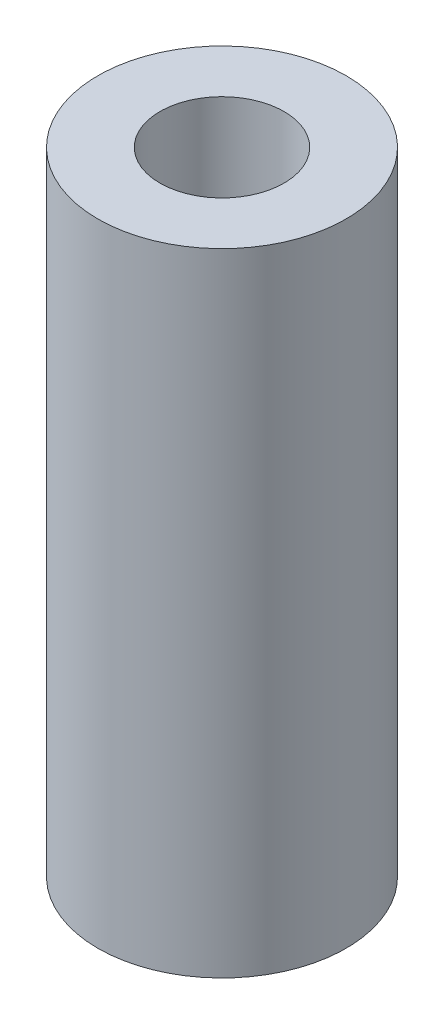
ISO-10303-21;
HEADER;
FILE_DESCRIPTION(('STEP AP214'),'2;1');
FILE_NAME('part.step','',(''),(''),'','','');
FILE_SCHEMA(('AUTOMOTIVE_DESIGN { 1 0 10303 214 1 1 1 1 }'));
ENDSEC;
DATA;
#1=APPLICATION_CONTEXT('core data for automotive mechanical design processes');
#2=APPLICATION_PROTOCOL_DEFINITION('international standard','automotive_design',2000,#1);
#3=PRODUCT_CONTEXT('',#1,'mechanical');
#4=PRODUCT('Part','Part','',(#3));
#5=PRODUCT_RELATED_PRODUCT_CATEGORY('part','',(#4));
#6=PRODUCT_DEFINITION_FORMATION('','',#4);
#7=PRODUCT_DEFINITION_CONTEXT('part definition',#1,'design');
#8=PRODUCT_DEFINITION('design','',#6,#7);
#9=PRODUCT_DEFINITION_SHAPE('','',#8);
#10=(LENGTH_UNIT() NAMED_UNIT(*) SI_UNIT(.MILLI.,.METRE.));
#11=(NAMED_UNIT(*) PLANE_ANGLE_UNIT() SI_UNIT($,.RADIAN.));
#12=(NAMED_UNIT(*) SI_UNIT($,.STERADIAN.) SOLID_ANGLE_UNIT());
#13=UNCERTAINTY_MEASURE_WITH_UNIT(LENGTH_MEASURE(1.E-05),#10,'distance_accuracy_value','');
#14=(GEOMETRIC_REPRESENTATION_CONTEXT(3) GLOBAL_UNCERTAINTY_ASSIGNED_CONTEXT((#13)) GLOBAL_UNIT_ASSIGNED_CONTEXT((#10,
#11,#12)) REPRESENTATION_CONTEXT('',''));
#15=CARTESIAN_POINT('',(0.,0.,0.));
#16=DIRECTION('',(0.,0.,1.));
#17=DIRECTION('',(1.,0.,0.));
#18=AXIS2_PLACEMENT_3D('',#15,#16,#17);
#19=CARTESIAN_POINT('',(0.,22.9,0.));
#20=DIRECTION('',(0.,1.,0.));
#21=DIRECTION('',(0.,0.,1.));
#22=AXIS2_PLACEMENT_3D('',#19,#20,#21);
#23=PLANE('',#22);
#24=CARTESIAN_POINT('',(0.,22.9,0.));
#25=DIRECTION('',(0.,1.,0.));
#26=DIRECTION('',(0.,0.,1.));
#27=AXIS2_PLACEMENT_3D('',#24,#25,#26);
#28=CIRCLE('',#27,4.5);
#29=CARTESIAN_POINT('',(0.,22.9,4.5));
#30=VERTEX_POINT('',#29);
#31=EDGE_CURVE('E10',#30,#30,#28,.T.);
#32=ORIENTED_EDGE('',*,*,#31,.T.);
#33=EDGE_LOOP('',(#32));
#34=FACE_BOUND('',#33,.T.);
#35=CARTESIAN_POINT('',(0.,22.9,0.));
#36=DIRECTION('',(0.,1.,0.));
#37=DIRECTION('',(0.,0.,1.));
#38=AXIS2_PLACEMENT_3D('',#35,#36,#37);
#39=CIRCLE('',#38,2.25);
#40=CARTESIAN_POINT('',(0.,22.9,2.25));
#41=VERTEX_POINT('',#40);
#42=EDGE_CURVE('E45',#41,#41,#39,.T.);
#43=ORIENTED_EDGE('',*,*,#42,.F.);
#44=EDGE_LOOP('',(#43));
#45=FACE_BOUND('',#44,.T.);
#46=ADVANCED_FACE('F34',(#34,#45),#23,.T.);
#47=CARTESIAN_POINT('',(0.,0.,0.));
#48=DIRECTION('',(0.,1.,0.));
#49=DIRECTION('',(0.,0.,1.));
#50=AXIS2_PLACEMENT_3D('',#47,#48,#49);
#51=PLANE('',#50);
#52=CARTESIAN_POINT('',(0.,0.,0.));
#53=DIRECTION('',(0.,1.,0.));
#54=DIRECTION('',(0.,0.,1.));
#55=AXIS2_PLACEMENT_3D('',#52,#53,#54);
#56=CIRCLE('',#55,4.5);
#57=CARTESIAN_POINT('',(0.,0.,4.5));
#58=VERTEX_POINT('',#57);
#59=EDGE_CURVE('E38',#58,#58,#56,.T.);
#60=ORIENTED_EDGE('',*,*,#59,.F.);
#61=EDGE_LOOP('',(#60));
#62=FACE_BOUND('',#61,.T.);
#63=CARTESIAN_POINT('',(0.,0.,0.));
#64=DIRECTION('',(0.,1.,0.));
#65=DIRECTION('',(0.,0.,1.));
#66=AXIS2_PLACEMENT_3D('',#63,#64,#65);
#67=CIRCLE('',#66,2.25);
#68=CARTESIAN_POINT('',(0.,0.,2.25));
#69=VERTEX_POINT('',#68);
#70=EDGE_CURVE('E47',#69,#69,#67,.T.);
#71=ORIENTED_EDGE('',*,*,#70,.T.);
#72=EDGE_LOOP('',(#71));
#73=FACE_BOUND('',#72,.T.);
#74=ADVANCED_FACE('F57',(#62,#73),#51,.F.);
#75=CARTESIAN_POINT('',(0.,22.9,0.));
#76=DIRECTION('',(0.,-1.,0.));
#77=DIRECTION('',(0.,0.,-1.));
#78=AXIS2_PLACEMENT_3D('',#75,#76,#77);
#79=CYLINDRICAL_SURFACE('',#78,4.5);
#80=ORIENTED_EDGE('',*,*,#31,.F.);
#81=EDGE_LOOP('',(#80));
#82=FACE_BOUND('',#81,.T.);
#83=ORIENTED_EDGE('',*,*,#59,.T.);
#84=EDGE_LOOP('',(#83));
#85=FACE_BOUND('',#84,.T.);
#86=ADVANCED_FACE('F36',(#82,#85),#79,.T.);
#87=CARTESIAN_POINT('',(0.,22.9,0.));
#88=DIRECTION('',(0.,-1.,0.));
#89=DIRECTION('',(0.,0.,-1.));
#90=AXIS2_PLACEMENT_3D('',#87,#88,#89);
#91=CYLINDRICAL_SURFACE('',#90,2.25);
#92=ORIENTED_EDGE('',*,*,#42,.T.);
#93=EDGE_LOOP('',(#92));
#94=FACE_BOUND('',#93,.T.);
#95=ORIENTED_EDGE('',*,*,#70,.F.);
#96=EDGE_LOOP('',(#95));
#97=FACE_BOUND('',#96,.T.);
#98=ADVANCED_FACE('F53',(#94,#97),#91,.F.);
#99=CLOSED_SHELL('',(#46,#74,#86,#98));
#100=MANIFOLD_SOLID_BREP('B2',#99);
#101=ADVANCED_BREP_SHAPE_REPRESENTATION('',(#18,#100),#14);
#102=SHAPE_DEFINITION_REPRESENTATION(#9,#101);
ENDSEC;
END-ISO-10303-21;
